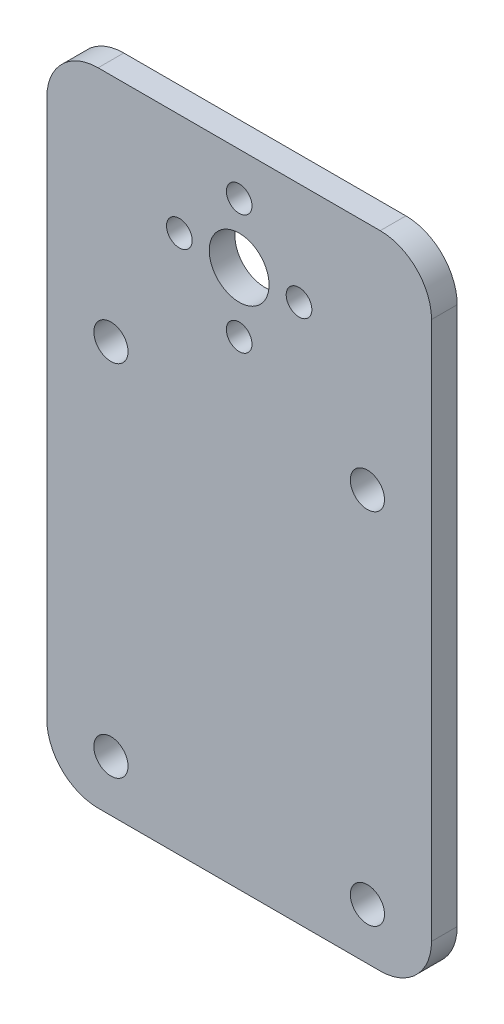
ISO-10303-21;
HEADER;
FILE_DESCRIPTION(('STEP AP214'),'2;1');
FILE_NAME('part.step','',(''),(''),'','','');
FILE_SCHEMA(('AUTOMOTIVE_DESIGN { 1 0 10303 214 1 1 1 1 }'));
ENDSEC;
DATA;
#1=APPLICATION_CONTEXT('core data for automotive mechanical design processes');
#2=APPLICATION_PROTOCOL_DEFINITION('international standard','automotive_design',2000,#1);
#3=PRODUCT_CONTEXT('',#1,'mechanical');
#4=PRODUCT('Part','Part','',(#3));
#5=PRODUCT_RELATED_PRODUCT_CATEGORY('part','',(#4));
#6=PRODUCT_DEFINITION_FORMATION('','',#4);
#7=PRODUCT_DEFINITION_CONTEXT('part definition',#1,'design');
#8=PRODUCT_DEFINITION('design','',#6,#7);
#9=PRODUCT_DEFINITION_SHAPE('','',#8);
#10=(LENGTH_UNIT() NAMED_UNIT(*) SI_UNIT(.MILLI.,.METRE.));
#11=(NAMED_UNIT(*) PLANE_ANGLE_UNIT() SI_UNIT($,.RADIAN.));
#12=(NAMED_UNIT(*) SI_UNIT($,.STERADIAN.) SOLID_ANGLE_UNIT());
#13=UNCERTAINTY_MEASURE_WITH_UNIT(LENGTH_MEASURE(1.E-05),#10,'distance_accuracy_value','');
#14=(GEOMETRIC_REPRESENTATION_CONTEXT(3) GLOBAL_UNCERTAINTY_ASSIGNED_CONTEXT((#13)) GLOBAL_UNIT_ASSIGNED_CONTEXT((#10,
#11,#12)) REPRESENTATION_CONTEXT('',''));
#15=CARTESIAN_POINT('',(0.,0.,0.));
#16=DIRECTION('',(0.,0.,1.));
#17=DIRECTION('',(1.,0.,0.));
#18=AXIS2_PLACEMENT_3D('',#15,#16,#17);
#19=CARTESIAN_POINT('',(0.,0.,3.));
#20=DIRECTION('',(0.,0.,-1.));
#21=DIRECTION('',(-1.,0.,0.));
#22=AXIS2_PLACEMENT_3D('',#19,#20,#21);
#23=PLANE('',#22);
#24=DIRECTION('',(1.,0.,0.));
#25=VECTOR('',#24,1.);
#26=CARTESIAN_POINT('',(-22.5,-37.5,3.));
#27=LINE('',#26,#25);
#28=CARTESIAN_POINT('',(-16.5,-37.5,3.));
#29=VERTEX_POINT('',#28);
#30=CARTESIAN_POINT('',(16.5,-37.5,3.));
#31=VERTEX_POINT('',#30);
#32=EDGE_CURVE('E154',#29,#31,#27,.T.);
#33=ORIENTED_EDGE('',*,*,#32,.T.);
#34=CARTESIAN_POINT('',(16.5,-31.5,3.));
#35=DIRECTION('',(0.,0.,-1.));
#36=DIRECTION('',(-1.,0.,0.));
#37=AXIS2_PLACEMENT_3D('',#34,#35,#36);
#38=CIRCLE('',#37,6.);
#39=CARTESIAN_POINT('',(22.5,-31.5,3.));
#40=VERTEX_POINT('',#39);
#41=EDGE_CURVE('E183',#31,#40,#38,.F.);
#42=ORIENTED_EDGE('',*,*,#41,.T.);
#43=DIRECTION('',(0.,1.,0.));
#44=VECTOR('',#43,1.);
#45=CARTESIAN_POINT('',(22.5,-37.5,3.));
#46=LINE('',#45,#44);
#47=CARTESIAN_POINT('',(22.5,31.5,3.));
#48=VERTEX_POINT('',#47);
#49=EDGE_CURVE('E132',#40,#48,#46,.T.);
#50=ORIENTED_EDGE('',*,*,#49,.T.);
#51=CARTESIAN_POINT('',(16.5,31.5,3.));
#52=DIRECTION('',(0.,0.,-1.));
#53=DIRECTION('',(-1.,0.,0.));
#54=AXIS2_PLACEMENT_3D('',#51,#52,#53);
#55=CIRCLE('',#54,6.);
#56=CARTESIAN_POINT('',(16.5,37.5,3.));
#57=VERTEX_POINT('',#56);
#58=EDGE_CURVE('E177',#48,#57,#55,.F.);
#59=ORIENTED_EDGE('',*,*,#58,.T.);
#60=DIRECTION('',(-1.,0.,0.));
#61=VECTOR('',#60,1.);
#62=CARTESIAN_POINT('',(-22.5,37.5,3.));
#63=LINE('',#62,#61);
#64=CARTESIAN_POINT('',(-16.5,37.5,3.));
#65=VERTEX_POINT('',#64);
#66=EDGE_CURVE('E196',#57,#65,#63,.T.);
#67=ORIENTED_EDGE('',*,*,#66,.T.);
#68=CARTESIAN_POINT('',(-16.5,31.5,3.));
#69=DIRECTION('',(0.,0.,-1.));
#70=DIRECTION('',(-1.,0.,0.));
#71=AXIS2_PLACEMENT_3D('',#68,#69,#70);
#72=CIRCLE('',#71,6.);
#73=CARTESIAN_POINT('',(-22.5,31.5,3.));
#74=VERTEX_POINT('',#73);
#75=EDGE_CURVE('E66',#65,#74,#72,.F.);
#76=ORIENTED_EDGE('',*,*,#75,.T.);
#77=DIRECTION('',(0.,-1.,0.));
#78=VECTOR('',#77,1.);
#79=CARTESIAN_POINT('',(-22.5,-37.5,3.));
#80=LINE('',#79,#78);
#81=CARTESIAN_POINT('',(-22.5,-31.5,3.));
#82=VERTEX_POINT('',#81);
#83=EDGE_CURVE('E203',#74,#82,#80,.T.);
#84=ORIENTED_EDGE('',*,*,#83,.T.);
#85=CARTESIAN_POINT('',(-16.5,-31.5,3.));
#86=DIRECTION('',(0.,0.,-1.));
#87=DIRECTION('',(-1.,0.,0.));
#88=AXIS2_PLACEMENT_3D('',#85,#86,#87);
#89=CIRCLE('',#88,6.);
#90=EDGE_CURVE('E180',#82,#29,#89,.F.);
#91=ORIENTED_EDGE('',*,*,#90,.T.);
#92=EDGE_LOOP('',(#33,#42,#50,#59,#67,#76,#84,#91));
#93=FACE_BOUND('',#92,.T.);
#94=CARTESIAN_POINT('',(-15.,10.5,3.));
#95=DIRECTION('',(0.,0.,1.));
#96=DIRECTION('',(1.,0.,0.));
#97=AXIS2_PLACEMENT_3D('',#94,#95,#96);
#98=CIRCLE('',#97,2.);
#99=CARTESIAN_POINT('',(-13.,10.5,3.));
#100=VERTEX_POINT('',#99);
#101=EDGE_CURVE('E143',#100,#100,#98,.T.);
#102=ORIENTED_EDGE('',*,*,#101,.F.);
#103=EDGE_LOOP('',(#102));
#104=FACE_BOUND('',#103,.T.);
#105=CARTESIAN_POINT('',(15.,10.5,3.));
#106=DIRECTION('',(0.,0.,1.));
#107=DIRECTION('',(1.,0.,0.));
#108=AXIS2_PLACEMENT_3D('',#105,#106,#107);
#109=CIRCLE('',#108,2.00000000000001);
#110=CARTESIAN_POINT('',(17.,10.5,3.));
#111=VERTEX_POINT('',#110);
#112=EDGE_CURVE('E222',#111,#111,#109,.T.);
#113=ORIENTED_EDGE('',*,*,#112,.F.);
#114=EDGE_LOOP('',(#113));
#115=FACE_BOUND('',#114,.T.);
#116=CARTESIAN_POINT('',(15.,-31.5,3.));
#117=DIRECTION('',(0.,0.,1.));
#118=DIRECTION('',(1.,0.,0.));
#119=AXIS2_PLACEMENT_3D('',#116,#117,#118);
#120=CIRCLE('',#119,2.);
#121=CARTESIAN_POINT('',(17.,-31.5,3.));
#122=VERTEX_POINT('',#121);
#123=EDGE_CURVE('E228',#122,#122,#120,.T.);
#124=ORIENTED_EDGE('',*,*,#123,.F.);
#125=EDGE_LOOP('',(#124));
#126=FACE_BOUND('',#125,.T.);
#127=CARTESIAN_POINT('',(-15.,-31.5,3.));
#128=DIRECTION('',(0.,0.,1.));
#129=DIRECTION('',(1.,0.,0.));
#130=AXIS2_PLACEMENT_3D('',#127,#128,#129);
#131=CIRCLE('',#130,2.);
#132=CARTESIAN_POINT('',(-13.,-31.5,3.));
#133=VERTEX_POINT('',#132);
#134=EDGE_CURVE('E236',#133,#133,#131,.T.);
#135=ORIENTED_EDGE('',*,*,#134,.F.);
#136=EDGE_LOOP('',(#135));
#137=FACE_BOUND('',#136,.T.);
#138=CARTESIAN_POINT('',(0.,32.5,3.));
#139=DIRECTION('',(0.,0.,1.));
#140=DIRECTION('',(1.,0.,0.));
#141=AXIS2_PLACEMENT_3D('',#138,#139,#140);
#142=CIRCLE('',#141,1.5);
#143=CARTESIAN_POINT('',(1.5,32.5,3.));
#144=VERTEX_POINT('',#143);
#145=EDGE_CURVE('E244',#144,#144,#142,.T.);
#146=ORIENTED_EDGE('',*,*,#145,.F.);
#147=EDGE_LOOP('',(#146));
#148=FACE_BOUND('',#147,.T.);
#149=CARTESIAN_POINT('',(7.,25.5,3.));
#150=DIRECTION('',(0.,0.,1.));
#151=DIRECTION('',(1.,0.,0.));
#152=AXIS2_PLACEMENT_3D('',#149,#150,#151);
#153=CIRCLE('',#152,1.5);
#154=CARTESIAN_POINT('',(8.5,25.5,3.));
#155=VERTEX_POINT('',#154);
#156=EDGE_CURVE('E252',#155,#155,#153,.T.);
#157=ORIENTED_EDGE('',*,*,#156,.F.);
#158=EDGE_LOOP('',(#157));
#159=FACE_BOUND('',#158,.T.);
#160=CARTESIAN_POINT('',(0.,18.5,3.));
#161=DIRECTION('',(0.,0.,1.));
#162=DIRECTION('',(1.,0.,0.));
#163=AXIS2_PLACEMENT_3D('',#160,#161,#162);
#164=CIRCLE('',#163,1.5);
#165=CARTESIAN_POINT('',(1.5,18.5,3.));
#166=VERTEX_POINT('',#165);
#167=EDGE_CURVE('E260',#166,#166,#164,.T.);
#168=ORIENTED_EDGE('',*,*,#167,.F.);
#169=EDGE_LOOP('',(#168));
#170=FACE_BOUND('',#169,.T.);
#171=CARTESIAN_POINT('',(-7.,25.5,3.));
#172=DIRECTION('',(0.,0.,1.));
#173=DIRECTION('',(1.,0.,0.));
#174=AXIS2_PLACEMENT_3D('',#171,#172,#173);
#175=CIRCLE('',#174,1.5);
#176=CARTESIAN_POINT('',(-5.5,25.5,3.));
#177=VERTEX_POINT('',#176);
#178=EDGE_CURVE('E268',#177,#177,#175,.T.);
#179=ORIENTED_EDGE('',*,*,#178,.F.);
#180=EDGE_LOOP('',(#179));
#181=FACE_BOUND('',#180,.T.);
#182=CARTESIAN_POINT('',(0.,25.5,3.));
#183=DIRECTION('',(0.,0.,1.));
#184=DIRECTION('',(1.,0.,0.));
#185=AXIS2_PLACEMENT_3D('',#182,#183,#184);
#186=CIRCLE('',#185,3.5);
#187=CARTESIAN_POINT('',(3.5,25.5,3.));
#188=VERTEX_POINT('',#187);
#189=EDGE_CURVE('E276',#188,#188,#186,.T.);
#190=ORIENTED_EDGE('',*,*,#189,.F.);
#191=EDGE_LOOP('',(#190));
#192=FACE_BOUND('',#191,.T.);
#193=ADVANCED_FACE('F43',(#93,#104,#115,#126,#137,#148,#159,#170,#181,#192),#23,.F.);
#194=CARTESIAN_POINT('',(0.,0.,0.));
#195=DIRECTION('',(0.,0.,-1.));
#196=DIRECTION('',(-1.,0.,0.));
#197=AXIS2_PLACEMENT_3D('',#194,#195,#196);
#198=PLANE('',#197);
#199=CARTESIAN_POINT('',(-7.,25.5,0.));
#200=DIRECTION('',(0.,0.,1.));
#201=DIRECTION('',(1.,0.,0.));
#202=AXIS2_PLACEMENT_3D('',#199,#200,#201);
#203=CIRCLE('',#202,1.5);
#204=CARTESIAN_POINT('',(-5.5,25.5,0.));
#205=VERTEX_POINT('',#204);
#206=EDGE_CURVE('E272',#205,#205,#203,.T.);
#207=ORIENTED_EDGE('',*,*,#206,.T.);
#208=EDGE_LOOP('',(#207));
#209=FACE_BOUND('',#208,.T.);
#210=CARTESIAN_POINT('',(7.,25.5,0.));
#211=DIRECTION('',(0.,0.,1.));
#212=DIRECTION('',(1.,0.,0.));
#213=AXIS2_PLACEMENT_3D('',#210,#211,#212);
#214=CIRCLE('',#213,1.5);
#215=CARTESIAN_POINT('',(8.5,25.5,0.));
#216=VERTEX_POINT('',#215);
#217=EDGE_CURVE('E256',#216,#216,#214,.T.);
#218=ORIENTED_EDGE('',*,*,#217,.T.);
#219=EDGE_LOOP('',(#218));
#220=FACE_BOUND('',#219,.T.);
#221=CARTESIAN_POINT('',(-15.,-31.5,0.));
#222=DIRECTION('',(0.,0.,1.));
#223=DIRECTION('',(1.,0.,0.));
#224=AXIS2_PLACEMENT_3D('',#221,#222,#223);
#225=CIRCLE('',#224,2.);
#226=CARTESIAN_POINT('',(-13.,-31.5,0.));
#227=VERTEX_POINT('',#226);
#228=EDGE_CURVE('E240',#227,#227,#225,.T.);
#229=ORIENTED_EDGE('',*,*,#228,.T.);
#230=EDGE_LOOP('',(#229));
#231=FACE_BOUND('',#230,.T.);
#232=CARTESIAN_POINT('',(15.,10.5,0.));
#233=DIRECTION('',(0.,0.,1.));
#234=DIRECTION('',(1.,0.,0.));
#235=AXIS2_PLACEMENT_3D('',#232,#233,#234);
#236=CIRCLE('',#235,2.00000000000001);
#237=CARTESIAN_POINT('',(17.,10.5,0.));
#238=VERTEX_POINT('',#237);
#239=EDGE_CURVE('E224',#238,#238,#236,.T.);
#240=ORIENTED_EDGE('',*,*,#239,.T.);
#241=EDGE_LOOP('',(#240));
#242=FACE_BOUND('',#241,.T.);
#243=DIRECTION('',(0.,1.,0.));
#244=VECTOR('',#243,1.);
#245=CARTESIAN_POINT('',(22.5,-37.5,0.));
#246=LINE('',#245,#244);
#247=CARTESIAN_POINT('',(22.5,-31.5,0.));
#248=VERTEX_POINT('',#247);
#249=CARTESIAN_POINT('',(22.5,31.5,0.));
#250=VERTEX_POINT('',#249);
#251=EDGE_CURVE('E129',#248,#250,#246,.T.);
#252=ORIENTED_EDGE('',*,*,#251,.F.);
#253=CARTESIAN_POINT('',(16.5,-31.5,0.));
#254=DIRECTION('',(0.,0.,-1.));
#255=DIRECTION('',(-1.,0.,0.));
#256=AXIS2_PLACEMENT_3D('',#253,#254,#255);
#257=CIRCLE('',#256,6.);
#258=CARTESIAN_POINT('',(16.5,-37.5,0.));
#259=VERTEX_POINT('',#258);
#260=EDGE_CURVE('E111',#248,#259,#257,.T.);
#261=ORIENTED_EDGE('',*,*,#260,.T.);
#262=DIRECTION('',(1.,0.,0.));
#263=VECTOR('',#262,1.);
#264=CARTESIAN_POINT('',(-22.5,-37.5,0.));
#265=LINE('',#264,#263);
#266=CARTESIAN_POINT('',(-16.5,-37.5,0.));
#267=VERTEX_POINT('',#266);
#268=EDGE_CURVE('E159',#267,#259,#265,.T.);
#269=ORIENTED_EDGE('',*,*,#268,.F.);
#270=CARTESIAN_POINT('',(-16.5,-31.5,0.));
#271=DIRECTION('',(0.,0.,-1.));
#272=DIRECTION('',(-1.,0.,0.));
#273=AXIS2_PLACEMENT_3D('',#270,#271,#272);
#274=CIRCLE('',#273,6.);
#275=CARTESIAN_POINT('',(-22.5,-31.5,0.));
#276=VERTEX_POINT('',#275);
#277=EDGE_CURVE('E123',#267,#276,#274,.T.);
#278=ORIENTED_EDGE('',*,*,#277,.T.);
#279=DIRECTION('',(0.,-1.,0.));
#280=VECTOR('',#279,1.);
#281=CARTESIAN_POINT('',(-22.5,-37.5,0.));
#282=LINE('',#281,#280);
#283=CARTESIAN_POINT('',(-22.5,31.5,0.));
#284=VERTEX_POINT('',#283);
#285=EDGE_CURVE('E148',#284,#276,#282,.T.);
#286=ORIENTED_EDGE('',*,*,#285,.F.);
#287=CARTESIAN_POINT('',(-16.5,31.5,0.));
#288=DIRECTION('',(0.,0.,-1.));
#289=DIRECTION('',(-1.,0.,0.));
#290=AXIS2_PLACEMENT_3D('',#287,#288,#289);
#291=CIRCLE('',#290,6.);
#292=CARTESIAN_POINT('',(-16.5,37.5,0.));
#293=VERTEX_POINT('',#292);
#294=EDGE_CURVE('E134',#284,#293,#291,.T.);
#295=ORIENTED_EDGE('',*,*,#294,.T.);
#296=DIRECTION('',(-1.,0.,0.));
#297=VECTOR('',#296,1.);
#298=CARTESIAN_POINT('',(-22.5,37.5,0.));
#299=LINE('',#298,#297);
#300=CARTESIAN_POINT('',(16.5,37.5,0.));
#301=VERTEX_POINT('',#300);
#302=EDGE_CURVE('E142',#301,#293,#299,.T.);
#303=ORIENTED_EDGE('',*,*,#302,.F.);
#304=CARTESIAN_POINT('',(16.5,31.5,0.));
#305=DIRECTION('',(0.,0.,-1.));
#306=DIRECTION('',(-1.,0.,0.));
#307=AXIS2_PLACEMENT_3D('',#304,#305,#306);
#308=CIRCLE('',#307,6.);
#309=EDGE_CURVE('E140',#301,#250,#308,.T.);
#310=ORIENTED_EDGE('',*,*,#309,.T.);
#311=EDGE_LOOP('',(#252,#261,#269,#278,#286,#295,#303,#310));
#312=FACE_BOUND('',#311,.T.);
#313=CARTESIAN_POINT('',(-15.,10.5,0.));
#314=DIRECTION('',(0.,0.,1.));
#315=DIRECTION('',(1.,0.,0.));
#316=AXIS2_PLACEMENT_3D('',#313,#314,#315);
#317=CIRCLE('',#316,2.);
#318=CARTESIAN_POINT('',(-13.,10.5,0.));
#319=VERTEX_POINT('',#318);
#320=EDGE_CURVE('E151',#319,#319,#317,.T.);
#321=ORIENTED_EDGE('',*,*,#320,.T.);
#322=EDGE_LOOP('',(#321));
#323=FACE_BOUND('',#322,.T.);
#324=CARTESIAN_POINT('',(15.,-31.5,0.));
#325=DIRECTION('',(0.,0.,1.));
#326=DIRECTION('',(1.,0.,0.));
#327=AXIS2_PLACEMENT_3D('',#324,#325,#326);
#328=CIRCLE('',#327,2.);
#329=CARTESIAN_POINT('',(17.,-31.5,0.));
#330=VERTEX_POINT('',#329);
#331=EDGE_CURVE('E232',#330,#330,#328,.T.);
#332=ORIENTED_EDGE('',*,*,#331,.T.);
#333=EDGE_LOOP('',(#332));
#334=FACE_BOUND('',#333,.T.);
#335=CARTESIAN_POINT('',(0.,32.5,0.));
#336=DIRECTION('',(0.,0.,1.));
#337=DIRECTION('',(1.,0.,0.));
#338=AXIS2_PLACEMENT_3D('',#335,#336,#337);
#339=CIRCLE('',#338,1.5);
#340=CARTESIAN_POINT('',(1.5,32.5,0.));
#341=VERTEX_POINT('',#340);
#342=EDGE_CURVE('E248',#341,#341,#339,.T.);
#343=ORIENTED_EDGE('',*,*,#342,.T.);
#344=EDGE_LOOP('',(#343));
#345=FACE_BOUND('',#344,.T.);
#346=CARTESIAN_POINT('',(0.,18.5,0.));
#347=DIRECTION('',(0.,0.,1.));
#348=DIRECTION('',(1.,0.,0.));
#349=AXIS2_PLACEMENT_3D('',#346,#347,#348);
#350=CIRCLE('',#349,1.5);
#351=CARTESIAN_POINT('',(1.5,18.5,0.));
#352=VERTEX_POINT('',#351);
#353=EDGE_CURVE('E264',#352,#352,#350,.T.);
#354=ORIENTED_EDGE('',*,*,#353,.T.);
#355=EDGE_LOOP('',(#354));
#356=FACE_BOUND('',#355,.T.);
#357=CARTESIAN_POINT('',(0.,25.5,0.));
#358=DIRECTION('',(0.,0.,1.));
#359=DIRECTION('',(1.,0.,0.));
#360=AXIS2_PLACEMENT_3D('',#357,#358,#359);
#361=CIRCLE('',#360,3.5);
#362=CARTESIAN_POINT('',(3.5,25.5,0.));
#363=VERTEX_POINT('',#362);
#364=EDGE_CURVE('E280',#363,#363,#361,.T.);
#365=ORIENTED_EDGE('',*,*,#364,.T.);
#366=EDGE_LOOP('',(#365));
#367=FACE_BOUND('',#366,.T.);
#368=ADVANCED_FACE('F137',(#209,#220,#231,#242,#312,#323,#334,#345,#356,#367),#198,.T.);
#369=CARTESIAN_POINT('',(22.5,-37.5,3.));
#370=DIRECTION('',(-1.,0.,0.));
#371=DIRECTION('',(0.,0.,1.));
#372=AXIS2_PLACEMENT_3D('',#369,#370,#371);
#373=PLANE('',#372);
#374=ORIENTED_EDGE('',*,*,#49,.F.);
#375=DIRECTION('',(0.,0.,-1.));
#376=VECTOR('',#375,1.);
#377=CARTESIAN_POINT('',(22.5,-31.5,3.));
#378=LINE('',#377,#376);
#379=EDGE_CURVE('E115',#40,#248,#378,.T.);
#380=ORIENTED_EDGE('',*,*,#379,.T.);
#381=ORIENTED_EDGE('',*,*,#251,.T.);
#382=DIRECTION('',(0.,0.,-1.));
#383=VECTOR('',#382,1.);
#384=CARTESIAN_POINT('',(22.5,31.5,3.));
#385=LINE('',#384,#383);
#386=EDGE_CURVE('E135',#250,#48,#385,.F.);
#387=ORIENTED_EDGE('',*,*,#386,.T.);
#388=EDGE_LOOP('',(#374,#380,#381,#387));
#389=FACE_BOUND('',#388,.T.);
#390=ADVANCED_FACE('F128',(#389),#373,.F.);
#391=CARTESIAN_POINT('',(-22.5,37.5,3.));
#392=DIRECTION('',(0.,-1.,0.));
#393=DIRECTION('',(0.,0.,-1.));
#394=AXIS2_PLACEMENT_3D('',#391,#392,#393);
#395=PLANE('',#394);
#396=ORIENTED_EDGE('',*,*,#66,.F.);
#397=DIRECTION('',(0.,0.,-1.));
#398=VECTOR('',#397,1.);
#399=CARTESIAN_POINT('',(16.5,37.5,3.));
#400=LINE('',#399,#398);
#401=EDGE_CURVE('E11',#57,#301,#400,.T.);
#402=ORIENTED_EDGE('',*,*,#401,.T.);
#403=ORIENTED_EDGE('',*,*,#302,.T.);
#404=DIRECTION('',(0.,0.,-1.));
#405=VECTOR('',#404,1.);
#406=CARTESIAN_POINT('',(-16.5,37.5,3.));
#407=LINE('',#406,#405);
#408=EDGE_CURVE('E52',#293,#65,#407,.F.);
#409=ORIENTED_EDGE('',*,*,#408,.T.);
#410=EDGE_LOOP('',(#396,#402,#403,#409));
#411=FACE_BOUND('',#410,.T.);
#412=ADVANCED_FACE('F195',(#411),#395,.F.);
#413=CARTESIAN_POINT('',(-22.5,-37.5,3.));
#414=DIRECTION('',(1.,0.,0.));
#415=DIRECTION('',(0.,0.,-1.));
#416=AXIS2_PLACEMENT_3D('',#413,#414,#415);
#417=PLANE('',#416);
#418=ORIENTED_EDGE('',*,*,#285,.T.);
#419=DIRECTION('',(0.,0.,-1.));
#420=VECTOR('',#419,1.);
#421=CARTESIAN_POINT('',(-22.5,-31.5,3.));
#422=LINE('',#421,#420);
#423=EDGE_CURVE('E59',#276,#82,#422,.F.);
#424=ORIENTED_EDGE('',*,*,#423,.T.);
#425=ORIENTED_EDGE('',*,*,#83,.F.);
#426=DIRECTION('',(0.,0.,-1.));
#427=VECTOR('',#426,1.);
#428=CARTESIAN_POINT('',(-22.5,31.5,3.));
#429=LINE('',#428,#427);
#430=EDGE_CURVE('E186',#74,#284,#429,.T.);
#431=ORIENTED_EDGE('',*,*,#430,.T.);
#432=EDGE_LOOP('',(#418,#424,#425,#431));
#433=FACE_BOUND('',#432,.T.);
#434=ADVANCED_FACE('F207',(#433),#417,.F.);
#435=CARTESIAN_POINT('',(-22.5,-37.5,3.));
#436=DIRECTION('',(0.,1.,0.));
#437=DIRECTION('',(0.,0.,1.));
#438=AXIS2_PLACEMENT_3D('',#435,#436,#437);
#439=PLANE('',#438);
#440=ORIENTED_EDGE('',*,*,#268,.T.);
#441=DIRECTION('',(0.,0.,-1.));
#442=VECTOR('',#441,1.);
#443=CARTESIAN_POINT('',(16.5,-37.5,3.));
#444=LINE('',#443,#442);
#445=EDGE_CURVE('E116',#259,#31,#444,.F.);
#446=ORIENTED_EDGE('',*,*,#445,.T.);
#447=ORIENTED_EDGE('',*,*,#32,.F.);
#448=DIRECTION('',(0.,0.,-1.));
#449=VECTOR('',#448,1.);
#450=CARTESIAN_POINT('',(-16.5,-37.5,3.));
#451=LINE('',#450,#449);
#452=EDGE_CURVE('E122',#29,#267,#451,.T.);
#453=ORIENTED_EDGE('',*,*,#452,.T.);
#454=EDGE_LOOP('',(#440,#446,#447,#453));
#455=FACE_BOUND('',#454,.T.);
#456=ADVANCED_FACE('F214',(#455),#439,.F.);
#457=CARTESIAN_POINT('',(-15.,10.5,3.));
#458=DIRECTION('',(0.,0.,-1.));
#459=DIRECTION('',(-1.,0.,0.));
#460=AXIS2_PLACEMENT_3D('',#457,#458,#459);
#461=CYLINDRICAL_SURFACE('',#460,2.);
#462=ORIENTED_EDGE('',*,*,#101,.T.);
#463=EDGE_LOOP('',(#462));
#464=FACE_BOUND('',#463,.T.);
#465=ORIENTED_EDGE('',*,*,#320,.F.);
#466=EDGE_LOOP('',(#465));
#467=FACE_BOUND('',#466,.T.);
#468=ADVANCED_FACE('F299',(#464,#467),#461,.F.);
#469=CARTESIAN_POINT('',(15.,10.5,3.));
#470=DIRECTION('',(0.,0.,-1.));
#471=DIRECTION('',(-1.,0.,0.));
#472=AXIS2_PLACEMENT_3D('',#469,#470,#471);
#473=CYLINDRICAL_SURFACE('',#472,2.00000000000001);
#474=ORIENTED_EDGE('',*,*,#112,.T.);
#475=EDGE_LOOP('',(#474));
#476=FACE_BOUND('',#475,.T.);
#477=ORIENTED_EDGE('',*,*,#239,.F.);
#478=EDGE_LOOP('',(#477));
#479=FACE_BOUND('',#478,.T.);
#480=ADVANCED_FACE('F457',(#476,#479),#473,.F.);
#481=CARTESIAN_POINT('',(15.,-31.5,3.));
#482=DIRECTION('',(0.,0.,-1.));
#483=DIRECTION('',(-1.,0.,0.));
#484=AXIS2_PLACEMENT_3D('',#481,#482,#483);
#485=CYLINDRICAL_SURFACE('',#484,2.);
#486=ORIENTED_EDGE('',*,*,#123,.T.);
#487=EDGE_LOOP('',(#486));
#488=FACE_BOUND('',#487,.T.);
#489=ORIENTED_EDGE('',*,*,#331,.F.);
#490=EDGE_LOOP('',(#489));
#491=FACE_BOUND('',#490,.T.);
#492=ADVANCED_FACE('F446',(#488,#491),#485,.F.);
#493=CARTESIAN_POINT('',(-15.,-31.5,3.));
#494=DIRECTION('',(0.,0.,-1.));
#495=DIRECTION('',(-1.,0.,0.));
#496=AXIS2_PLACEMENT_3D('',#493,#494,#495);
#497=CYLINDRICAL_SURFACE('',#496,2.);
#498=ORIENTED_EDGE('',*,*,#134,.T.);
#499=EDGE_LOOP('',(#498));
#500=FACE_BOUND('',#499,.T.);
#501=ORIENTED_EDGE('',*,*,#228,.F.);
#502=EDGE_LOOP('',(#501));
#503=FACE_BOUND('',#502,.T.);
#504=ADVANCED_FACE('F435',(#500,#503),#497,.F.);
#505=CARTESIAN_POINT('',(0.,32.5,3.));
#506=DIRECTION('',(0.,0.,-1.));
#507=DIRECTION('',(-1.,0.,0.));
#508=AXIS2_PLACEMENT_3D('',#505,#506,#507);
#509=CYLINDRICAL_SURFACE('',#508,1.5);
#510=ORIENTED_EDGE('',*,*,#145,.T.);
#511=EDGE_LOOP('',(#510));
#512=FACE_BOUND('',#511,.T.);
#513=ORIENTED_EDGE('',*,*,#342,.F.);
#514=EDGE_LOOP('',(#513));
#515=FACE_BOUND('',#514,.T.);
#516=ADVANCED_FACE('F424',(#512,#515),#509,.F.);
#517=CARTESIAN_POINT('',(7.,25.5,3.));
#518=DIRECTION('',(0.,0.,-1.));
#519=DIRECTION('',(-1.,0.,0.));
#520=AXIS2_PLACEMENT_3D('',#517,#518,#519);
#521=CYLINDRICAL_SURFACE('',#520,1.5);
#522=ORIENTED_EDGE('',*,*,#156,.T.);
#523=EDGE_LOOP('',(#522));
#524=FACE_BOUND('',#523,.T.);
#525=ORIENTED_EDGE('',*,*,#217,.F.);
#526=EDGE_LOOP('',(#525));
#527=FACE_BOUND('',#526,.T.);
#528=ADVANCED_FACE('F413',(#524,#527),#521,.F.);
#529=CARTESIAN_POINT('',(0.,18.5,3.));
#530=DIRECTION('',(0.,0.,-1.));
#531=DIRECTION('',(-1.,0.,0.));
#532=AXIS2_PLACEMENT_3D('',#529,#530,#531);
#533=CYLINDRICAL_SURFACE('',#532,1.5);
#534=ORIENTED_EDGE('',*,*,#167,.T.);
#535=EDGE_LOOP('',(#534));
#536=FACE_BOUND('',#535,.T.);
#537=ORIENTED_EDGE('',*,*,#353,.F.);
#538=EDGE_LOOP('',(#537));
#539=FACE_BOUND('',#538,.T.);
#540=ADVANCED_FACE('F402',(#536,#539),#533,.F.);
#541=CARTESIAN_POINT('',(-7.,25.5,3.));
#542=DIRECTION('',(0.,0.,-1.));
#543=DIRECTION('',(-1.,0.,0.));
#544=AXIS2_PLACEMENT_3D('',#541,#542,#543);
#545=CYLINDRICAL_SURFACE('',#544,1.5);
#546=ORIENTED_EDGE('',*,*,#178,.T.);
#547=EDGE_LOOP('',(#546));
#548=FACE_BOUND('',#547,.T.);
#549=ORIENTED_EDGE('',*,*,#206,.F.);
#550=EDGE_LOOP('',(#549));
#551=FACE_BOUND('',#550,.T.);
#552=ADVANCED_FACE('F392',(#548,#551),#545,.F.);
#553=CARTESIAN_POINT('',(0.,25.5,3.));
#554=DIRECTION('',(0.,0.,-1.));
#555=DIRECTION('',(-1.,0.,0.));
#556=AXIS2_PLACEMENT_3D('',#553,#554,#555);
#557=CYLINDRICAL_SURFACE('',#556,3.5);
#558=ORIENTED_EDGE('',*,*,#189,.T.);
#559=EDGE_LOOP('',(#558));
#560=FACE_BOUND('',#559,.T.);
#561=ORIENTED_EDGE('',*,*,#364,.F.);
#562=EDGE_LOOP('',(#561));
#563=FACE_BOUND('',#562,.T.);
#564=ADVANCED_FACE('F288',(#560,#563),#557,.F.);
#565=CARTESIAN_POINT('',(16.5,-31.5,3.));
#566=DIRECTION('',(0.,0.,-1.));
#567=DIRECTION('',(-1.,0.,0.));
#568=AXIS2_PLACEMENT_3D('',#565,#566,#567);
#569=CYLINDRICAL_SURFACE('',#568,6.);
#570=ORIENTED_EDGE('',*,*,#41,.F.);
#571=ORIENTED_EDGE('',*,*,#445,.F.);
#572=ORIENTED_EDGE('',*,*,#260,.F.);
#573=ORIENTED_EDGE('',*,*,#379,.F.);
#574=EDGE_LOOP('',(#570,#571,#572,#573));
#575=FACE_BOUND('',#574,.T.);
#576=ADVANCED_FACE('F114',(#575),#569,.T.);
#577=CARTESIAN_POINT('',(-16.5,-31.5,3.));
#578=DIRECTION('',(0.,0.,-1.));
#579=DIRECTION('',(-1.,0.,0.));
#580=AXIS2_PLACEMENT_3D('',#577,#578,#579);
#581=CYLINDRICAL_SURFACE('',#580,6.);
#582=ORIENTED_EDGE('',*,*,#90,.F.);
#583=ORIENTED_EDGE('',*,*,#423,.F.);
#584=ORIENTED_EDGE('',*,*,#277,.F.);
#585=ORIENTED_EDGE('',*,*,#452,.F.);
#586=EDGE_LOOP('',(#582,#583,#584,#585));
#587=FACE_BOUND('',#586,.T.);
#588=ADVANCED_FACE('F211',(#587),#581,.T.);
#589=CARTESIAN_POINT('',(16.5,31.5,3.));
#590=DIRECTION('',(0.,0.,-1.));
#591=DIRECTION('',(-1.,0.,0.));
#592=AXIS2_PLACEMENT_3D('',#589,#590,#591);
#593=CYLINDRICAL_SURFACE('',#592,6.);
#594=ORIENTED_EDGE('',*,*,#58,.F.);
#595=ORIENTED_EDGE('',*,*,#386,.F.);
#596=ORIENTED_EDGE('',*,*,#309,.F.);
#597=ORIENTED_EDGE('',*,*,#401,.F.);
#598=EDGE_LOOP('',(#594,#595,#596,#597));
#599=FACE_BOUND('',#598,.T.);
#600=ADVANCED_FACE('F313',(#599),#593,.T.);
#601=CARTESIAN_POINT('',(-16.5,31.5,3.));
#602=DIRECTION('',(0.,0.,-1.));
#603=DIRECTION('',(-1.,0.,0.));
#604=AXIS2_PLACEMENT_3D('',#601,#602,#603);
#605=CYLINDRICAL_SURFACE('',#604,6.);
#606=ORIENTED_EDGE('',*,*,#75,.F.);
#607=ORIENTED_EDGE('',*,*,#408,.F.);
#608=ORIENTED_EDGE('',*,*,#294,.F.);
#609=ORIENTED_EDGE('',*,*,#430,.F.);
#610=EDGE_LOOP('',(#606,#607,#608,#609));
#611=FACE_BOUND('',#610,.T.);
#612=ADVANCED_FACE('F45',(#611),#605,.T.);
#613=CLOSED_SHELL('',(#193,#368,#390,#412,#434,#456,#468,#480,#492,#504,#516,#528,#540,#552,
#564,#576,#588,#600,#612));
#614=MANIFOLD_SOLID_BREP('B2',#613);
#615=ADVANCED_BREP_SHAPE_REPRESENTATION('',(#18,#614),#14);
#616=SHAPE_DEFINITION_REPRESENTATION(#9,#615);
ENDSEC;
END-ISO-10303-21;
